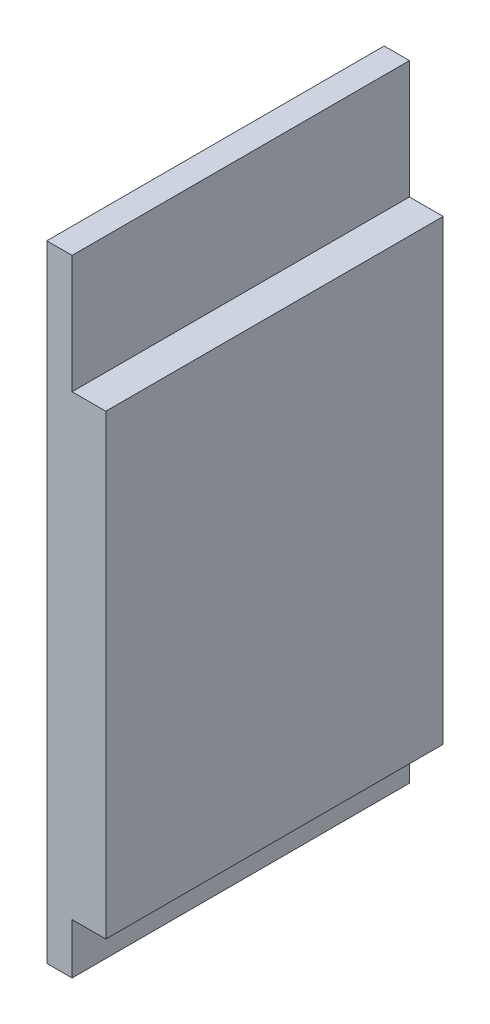
ISO-10303-21;
HEADER;
FILE_DESCRIPTION(('STEP AP214'),'2;1');
FILE_NAME('part.step','',(''),(''),'','','');
FILE_SCHEMA(('AUTOMOTIVE_DESIGN { 1 0 10303 214 1 1 1 1 }'));
ENDSEC;
DATA;
#1=APPLICATION_CONTEXT('core data for automotive mechanical design processes');
#2=APPLICATION_PROTOCOL_DEFINITION('international standard','automotive_design',2000,#1);
#3=PRODUCT_CONTEXT('',#1,'mechanical');
#4=PRODUCT('Part','Part','',(#3));
#5=PRODUCT_RELATED_PRODUCT_CATEGORY('part','',(#4));
#6=PRODUCT_DEFINITION_FORMATION('','',#4);
#7=PRODUCT_DEFINITION_CONTEXT('part definition',#1,'design');
#8=PRODUCT_DEFINITION('design','',#6,#7);
#9=PRODUCT_DEFINITION_SHAPE('','',#8);
#10=(LENGTH_UNIT() NAMED_UNIT(*) SI_UNIT(.MILLI.,.METRE.));
#11=(NAMED_UNIT(*) PLANE_ANGLE_UNIT() SI_UNIT($,.RADIAN.));
#12=(NAMED_UNIT(*) SI_UNIT($,.STERADIAN.) SOLID_ANGLE_UNIT());
#13=UNCERTAINTY_MEASURE_WITH_UNIT(LENGTH_MEASURE(1.E-05),#10,'distance_accuracy_value','');
#14=(GEOMETRIC_REPRESENTATION_CONTEXT(3) GLOBAL_UNCERTAINTY_ASSIGNED_CONTEXT((#13)) GLOBAL_UNIT_ASSIGNED_CONTEXT((#10,
#11,#12)) REPRESENTATION_CONTEXT('',''));
#15=CARTESIAN_POINT('',(0.,0.,0.));
#16=DIRECTION('',(0.,0.,1.));
#17=DIRECTION('',(1.,0.,0.));
#18=AXIS2_PLACEMENT_3D('',#15,#16,#17);
#19=CARTESIAN_POINT('',(3.75,-15.55,20.));
#20=DIRECTION('',(-1.,0.,0.));
#21=DIRECTION('',(0.,0.,1.));
#22=AXIS2_PLACEMENT_3D('',#19,#20,#21);
#23=PLANE('',#22);
#24=DIRECTION('',(0.,1.,0.));
#25=VECTOR('',#24,1.);
#26=CARTESIAN_POINT('',(3.75,-15.55,0.));
#27=LINE('',#26,#25);
#28=CARTESIAN_POINT('',(3.75,-15.55,0.));
#29=VERTEX_POINT('',#28);
#30=CARTESIAN_POINT('',(3.75,11.55,0.));
#31=VERTEX_POINT('',#30);
#32=EDGE_CURVE('E135',#29,#31,#27,.T.);
#33=ORIENTED_EDGE('',*,*,#32,.T.);
#34=DIRECTION('',(0.,0.,-1.));
#35=VECTOR('',#34,1.);
#36=CARTESIAN_POINT('',(3.75,11.55,20.));
#37=LINE('',#36,#35);
#38=CARTESIAN_POINT('',(3.75,11.55,20.));
#39=VERTEX_POINT('',#38);
#40=EDGE_CURVE('E11',#39,#31,#37,.T.);
#41=ORIENTED_EDGE('',*,*,#40,.F.);
#42=DIRECTION('',(0.,1.,0.));
#43=VECTOR('',#42,1.);
#44=CARTESIAN_POINT('',(3.75,-15.55,20.));
#45=LINE('',#44,#43);
#46=CARTESIAN_POINT('',(3.75,-15.55,20.));
#47=VERTEX_POINT('',#46);
#48=EDGE_CURVE('E149',#47,#39,#45,.T.);
#49=ORIENTED_EDGE('',*,*,#48,.F.);
#50=DIRECTION('',(0.,0.,-1.));
#51=VECTOR('',#50,1.);
#52=CARTESIAN_POINT('',(3.75,-15.55,20.));
#53=LINE('',#52,#51);
#54=EDGE_CURVE('E131',#47,#29,#53,.T.);
#55=ORIENTED_EDGE('',*,*,#54,.T.);
#56=EDGE_LOOP('',(#33,#41,#49,#55));
#57=FACE_BOUND('',#56,.T.);
#58=ADVANCED_FACE('F39',(#57),#23,.F.);
#59=CARTESIAN_POINT('',(3.75,11.55,20.));
#60=DIRECTION('',(0.,-1.,0.));
#61=DIRECTION('',(0.,0.,-1.));
#62=AXIS2_PLACEMENT_3D('',#59,#60,#61);
#63=PLANE('',#62);
#64=DIRECTION('',(-1.,0.,0.));
#65=VECTOR('',#64,1.);
#66=CARTESIAN_POINT('',(3.75,11.55,0.));
#67=LINE('',#66,#65);
#68=CARTESIAN_POINT('',(1.75,11.55,0.));
#69=VERTEX_POINT('',#68);
#70=EDGE_CURVE('E138',#31,#69,#67,.T.);
#71=ORIENTED_EDGE('',*,*,#70,.T.);
#72=DIRECTION('',(0.,0.,-1.));
#73=VECTOR('',#72,1.);
#74=CARTESIAN_POINT('',(1.75,11.55,20.));
#75=LINE('',#74,#73);
#76=CARTESIAN_POINT('',(1.75,11.55,20.));
#77=VERTEX_POINT('',#76);
#78=EDGE_CURVE('E47',#77,#69,#75,.T.);
#79=ORIENTED_EDGE('',*,*,#78,.F.);
#80=DIRECTION('',(-1.,0.,0.));
#81=VECTOR('',#80,1.);
#82=CARTESIAN_POINT('',(3.75,11.55,20.));
#83=LINE('',#82,#81);
#84=EDGE_CURVE('E98',#39,#77,#83,.T.);
#85=ORIENTED_EDGE('',*,*,#84,.F.);
#86=ORIENTED_EDGE('',*,*,#40,.T.);
#87=EDGE_LOOP('',(#71,#79,#85,#86));
#88=FACE_BOUND('',#87,.T.);
#89=ADVANCED_FACE('F184',(#88),#63,.F.);
#90=CARTESIAN_POINT('',(1.75,11.55,20.));
#91=DIRECTION('',(-1.,0.,0.));
#92=DIRECTION('',(0.,0.,1.));
#93=AXIS2_PLACEMENT_3D('',#90,#91,#92);
#94=PLANE('',#93);
#95=DIRECTION('',(0.,1.,0.));
#96=VECTOR('',#95,1.);
#97=CARTESIAN_POINT('',(1.75,11.55,0.));
#98=LINE('',#97,#96);
#99=CARTESIAN_POINT('',(1.75,18.55,0.));
#100=VERTEX_POINT('',#99);
#101=EDGE_CURVE('E140',#69,#100,#98,.T.);
#102=ORIENTED_EDGE('',*,*,#101,.T.);
#103=DIRECTION('',(0.,0.,-1.));
#104=VECTOR('',#103,1.);
#105=CARTESIAN_POINT('',(1.75,18.55,20.));
#106=LINE('',#105,#104);
#107=CARTESIAN_POINT('',(1.75,18.55,20.));
#108=VERTEX_POINT('',#107);
#109=EDGE_CURVE('E156',#108,#100,#106,.T.);
#110=ORIENTED_EDGE('',*,*,#109,.F.);
#111=DIRECTION('',(0.,1.,0.));
#112=VECTOR('',#111,1.);
#113=CARTESIAN_POINT('',(1.75,11.55,20.));
#114=LINE('',#113,#112);
#115=EDGE_CURVE('E164',#77,#108,#114,.T.);
#116=ORIENTED_EDGE('',*,*,#115,.F.);
#117=ORIENTED_EDGE('',*,*,#78,.T.);
#118=EDGE_LOOP('',(#102,#110,#116,#117));
#119=FACE_BOUND('',#118,.T.);
#120=ADVANCED_FACE('F162',(#119),#94,.F.);
#121=CARTESIAN_POINT('',(1.75,18.55,20.));
#122=DIRECTION('',(0.,-1.,0.));
#123=DIRECTION('',(0.,0.,-1.));
#124=AXIS2_PLACEMENT_3D('',#121,#122,#123);
#125=PLANE('',#124);
#126=DIRECTION('',(-1.,0.,0.));
#127=VECTOR('',#126,1.);
#128=CARTESIAN_POINT('',(1.75,18.55,0.));
#129=LINE('',#128,#127);
#130=CARTESIAN_POINT('',(0.25,18.55,0.));
#131=VERTEX_POINT('',#130);
#132=EDGE_CURVE('E142',#100,#131,#129,.T.);
#133=ORIENTED_EDGE('',*,*,#132,.T.);
#134=DIRECTION('',(0.,0.,-1.));
#135=VECTOR('',#134,1.);
#136=CARTESIAN_POINT('',(0.25,18.55,20.));
#137=LINE('',#136,#135);
#138=CARTESIAN_POINT('',(0.25,18.55,20.));
#139=VERTEX_POINT('',#138);
#140=EDGE_CURVE('E153',#139,#131,#137,.T.);
#141=ORIENTED_EDGE('',*,*,#140,.F.);
#142=DIRECTION('',(-1.,0.,0.));
#143=VECTOR('',#142,1.);
#144=CARTESIAN_POINT('',(1.75,18.55,20.));
#145=LINE('',#144,#143);
#146=EDGE_CURVE('E176',#108,#139,#145,.T.);
#147=ORIENTED_EDGE('',*,*,#146,.F.);
#148=ORIENTED_EDGE('',*,*,#109,.T.);
#149=EDGE_LOOP('',(#133,#141,#147,#148));
#150=FACE_BOUND('',#149,.T.);
#151=ADVANCED_FACE('F172',(#150),#125,.F.);
#152=CARTESIAN_POINT('',(0.25,18.55,20.));
#153=DIRECTION('',(1.,0.,0.));
#154=DIRECTION('',(0.,1.,0.));
#155=AXIS2_PLACEMENT_3D('',#152,#153,#154);
#156=PLANE('',#155);
#157=DIRECTION('',(0.,-1.,0.));
#158=VECTOR('',#157,1.);
#159=CARTESIAN_POINT('',(0.25,18.55,0.));
#160=LINE('',#159,#158);
#161=CARTESIAN_POINT('',(0.250000000000005,-18.55,0.));
#162=VERTEX_POINT('',#161);
#163=EDGE_CURVE('E144',#131,#162,#160,.T.);
#164=ORIENTED_EDGE('',*,*,#163,.T.);
#165=DIRECTION('',(0.,0.,-1.));
#166=VECTOR('',#165,1.);
#167=CARTESIAN_POINT('',(0.250000000000005,-18.55,20.));
#168=LINE('',#167,#166);
#169=CARTESIAN_POINT('',(0.250000000000005,-18.55,20.));
#170=VERTEX_POINT('',#169);
#171=EDGE_CURVE('E126',#170,#162,#168,.T.);
#172=ORIENTED_EDGE('',*,*,#171,.F.);
#173=DIRECTION('',(0.,-1.,0.));
#174=VECTOR('',#173,1.);
#175=CARTESIAN_POINT('',(0.25,18.55,20.));
#176=LINE('',#175,#174);
#177=EDGE_CURVE('E117',#139,#170,#176,.T.);
#178=ORIENTED_EDGE('',*,*,#177,.F.);
#179=ORIENTED_EDGE('',*,*,#140,.T.);
#180=EDGE_LOOP('',(#164,#172,#178,#179));
#181=FACE_BOUND('',#180,.T.);
#182=ADVANCED_FACE('F175',(#181),#156,.F.);
#183=CARTESIAN_POINT('',(0.250000000000005,-18.55,20.));
#184=DIRECTION('',(0.,1.,0.));
#185=DIRECTION('',(0.,0.,1.));
#186=AXIS2_PLACEMENT_3D('',#183,#184,#185);
#187=PLANE('',#186);
#188=DIRECTION('',(1.,0.,0.));
#189=VECTOR('',#188,1.);
#190=CARTESIAN_POINT('',(0.250000000000005,-18.55,0.));
#191=LINE('',#190,#189);
#192=CARTESIAN_POINT('',(1.75,-18.55,0.));
#193=VERTEX_POINT('',#192);
#194=EDGE_CURVE('E125',#162,#193,#191,.T.);
#195=ORIENTED_EDGE('',*,*,#194,.T.);
#196=DIRECTION('',(0.,0.,-1.));
#197=VECTOR('',#196,1.);
#198=CARTESIAN_POINT('',(1.75,-18.55,20.));
#199=LINE('',#198,#197);
#200=CARTESIAN_POINT('',(1.75,-18.55,20.));
#201=VERTEX_POINT('',#200);
#202=EDGE_CURVE('E122',#201,#193,#199,.T.);
#203=ORIENTED_EDGE('',*,*,#202,.F.);
#204=DIRECTION('',(1.,0.,0.));
#205=VECTOR('',#204,1.);
#206=CARTESIAN_POINT('',(0.250000000000005,-18.55,20.));
#207=LINE('',#206,#205);
#208=EDGE_CURVE('E111',#170,#201,#207,.T.);
#209=ORIENTED_EDGE('',*,*,#208,.F.);
#210=ORIENTED_EDGE('',*,*,#171,.T.);
#211=EDGE_LOOP('',(#195,#203,#209,#210));
#212=FACE_BOUND('',#211,.T.);
#213=ADVANCED_FACE('F123',(#212),#187,.F.);
#214=CARTESIAN_POINT('',(1.75,-18.55,20.));
#215=DIRECTION('',(-1.,0.,0.));
#216=DIRECTION('',(0.,0.,1.));
#217=AXIS2_PLACEMENT_3D('',#214,#215,#216);
#218=PLANE('',#217);
#219=DIRECTION('',(0.,1.,0.));
#220=VECTOR('',#219,1.);
#221=CARTESIAN_POINT('',(1.75,-18.55,0.));
#222=LINE('',#221,#220);
#223=CARTESIAN_POINT('',(1.75,-15.55,0.));
#224=VERTEX_POINT('',#223);
#225=EDGE_CURVE('E84',#193,#224,#222,.T.);
#226=ORIENTED_EDGE('',*,*,#225,.T.);
#227=DIRECTION('',(0.,0.,-1.));
#228=VECTOR('',#227,1.);
#229=CARTESIAN_POINT('',(1.75,-15.55,20.));
#230=LINE('',#229,#228);
#231=CARTESIAN_POINT('',(1.75,-15.55,20.));
#232=VERTEX_POINT('',#231);
#233=EDGE_CURVE('E127',#232,#224,#230,.T.);
#234=ORIENTED_EDGE('',*,*,#233,.F.);
#235=DIRECTION('',(0.,1.,0.));
#236=VECTOR('',#235,1.);
#237=CARTESIAN_POINT('',(1.75,-18.55,20.));
#238=LINE('',#237,#236);
#239=EDGE_CURVE('E115',#201,#232,#238,.T.);
#240=ORIENTED_EDGE('',*,*,#239,.F.);
#241=ORIENTED_EDGE('',*,*,#202,.T.);
#242=EDGE_LOOP('',(#226,#234,#240,#241));
#243=FACE_BOUND('',#242,.T.);
#244=ADVANCED_FACE('F129',(#243),#218,.F.);
#245=CARTESIAN_POINT('',(1.75,-15.55,20.));
#246=DIRECTION('',(0.,1.,0.));
#247=DIRECTION('',(0.,0.,1.));
#248=AXIS2_PLACEMENT_3D('',#245,#246,#247);
#249=PLANE('',#248);
#250=DIRECTION('',(1.,0.,0.));
#251=VECTOR('',#250,1.);
#252=CARTESIAN_POINT('',(1.75,-15.55,0.));
#253=LINE('',#252,#251);
#254=EDGE_CURVE('E90',#224,#29,#253,.T.);
#255=ORIENTED_EDGE('',*,*,#254,.T.);
#256=ORIENTED_EDGE('',*,*,#54,.F.);
#257=DIRECTION('',(1.,0.,0.));
#258=VECTOR('',#257,1.);
#259=CARTESIAN_POINT('',(1.75,-15.55,20.));
#260=LINE('',#259,#258);
#261=EDGE_CURVE('E55',#232,#47,#260,.T.);
#262=ORIENTED_EDGE('',*,*,#261,.F.);
#263=ORIENTED_EDGE('',*,*,#233,.T.);
#264=EDGE_LOOP('',(#255,#256,#262,#263));
#265=FACE_BOUND('',#264,.T.);
#266=ADVANCED_FACE('F200',(#265),#249,.F.);
#267=CARTESIAN_POINT('',(0.,0.,20.));
#268=DIRECTION('',(0.,0.,1.));
#269=DIRECTION('',(1.,0.,0.));
#270=AXIS2_PLACEMENT_3D('',#267,#268,#269);
#271=PLANE('',#270);
#272=ORIENTED_EDGE('',*,*,#48,.T.);
#273=ORIENTED_EDGE('',*,*,#84,.T.);
#274=ORIENTED_EDGE('',*,*,#115,.T.);
#275=ORIENTED_EDGE('',*,*,#146,.T.);
#276=ORIENTED_EDGE('',*,*,#177,.T.);
#277=ORIENTED_EDGE('',*,*,#208,.T.);
#278=ORIENTED_EDGE('',*,*,#239,.T.);
#279=ORIENTED_EDGE('',*,*,#261,.T.);
#280=EDGE_LOOP('',(#272,#273,#274,#275,#276,#277,#278,#279));
#281=FACE_BOUND('',#280,.T.);
#282=ADVANCED_FACE('F113',(#281),#271,.T.);
#283=CARTESIAN_POINT('',(0.,0.,0.));
#284=DIRECTION('',(0.,0.,1.));
#285=DIRECTION('',(1.,0.,0.));
#286=AXIS2_PLACEMENT_3D('',#283,#284,#285);
#287=PLANE('',#286);
#288=ORIENTED_EDGE('',*,*,#32,.F.);
#289=ORIENTED_EDGE('',*,*,#254,.F.);
#290=ORIENTED_EDGE('',*,*,#225,.F.);
#291=ORIENTED_EDGE('',*,*,#194,.F.);
#292=ORIENTED_EDGE('',*,*,#163,.F.);
#293=ORIENTED_EDGE('',*,*,#132,.F.);
#294=ORIENTED_EDGE('',*,*,#101,.F.);
#295=ORIENTED_EDGE('',*,*,#70,.F.);
#296=EDGE_LOOP('',(#288,#289,#290,#291,#292,#293,#294,#295));
#297=FACE_BOUND('',#296,.T.);
#298=ADVANCED_FACE('F168',(#297),#287,.F.);
#299=CLOSED_SHELL('',(#58,#89,#120,#151,#182,#213,#244,#266,#282,#298));
#300=MANIFOLD_SOLID_BREP('B2',#299);
#301=ADVANCED_BREP_SHAPE_REPRESENTATION('',(#18,#300),#14);
#302=SHAPE_DEFINITION_REPRESENTATION(#9,#301);
ENDSEC;
END-ISO-10303-21;
